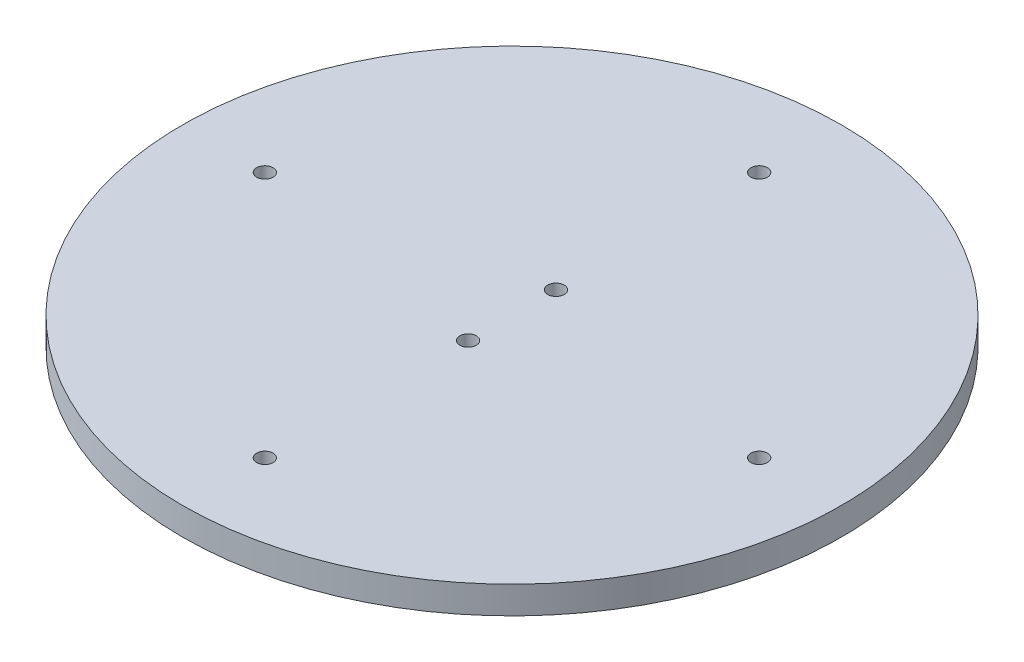
ISO-10303-21;
HEADER;
FILE_DESCRIPTION(('STEP AP214'),'2;1');
FILE_NAME('part.step','',(''),(''),'','','');
FILE_SCHEMA(('AUTOMOTIVE_DESIGN { 1 0 10303 214 1 1 1 1 }'));
ENDSEC;
DATA;
#1=APPLICATION_CONTEXT('core data for automotive mechanical design processes');
#2=APPLICATION_PROTOCOL_DEFINITION('international standard','automotive_design',2000,#1);
#3=PRODUCT_CONTEXT('',#1,'mechanical');
#4=PRODUCT('Part','Part','',(#3));
#5=PRODUCT_RELATED_PRODUCT_CATEGORY('part','',(#4));
#6=PRODUCT_DEFINITION_FORMATION('','',#4);
#7=PRODUCT_DEFINITION_CONTEXT('part definition',#1,'design');
#8=PRODUCT_DEFINITION('design','',#6,#7);
#9=PRODUCT_DEFINITION_SHAPE('','',#8);
#10=(LENGTH_UNIT() NAMED_UNIT(*) SI_UNIT(.MILLI.,.METRE.));
#11=(NAMED_UNIT(*) PLANE_ANGLE_UNIT() SI_UNIT($,.RADIAN.));
#12=(NAMED_UNIT(*) SI_UNIT($,.STERADIAN.) SOLID_ANGLE_UNIT());
#13=UNCERTAINTY_MEASURE_WITH_UNIT(LENGTH_MEASURE(1.E-05),#10,'distance_accuracy_value','');
#14=(GEOMETRIC_REPRESENTATION_CONTEXT(3) GLOBAL_UNCERTAINTY_ASSIGNED_CONTEXT((#13)) GLOBAL_UNIT_ASSIGNED_CONTEXT((#10,
#11,#12)) REPRESENTATION_CONTEXT('',''));
#15=CARTESIAN_POINT('',(0.,0.,0.));
#16=DIRECTION('',(0.,0.,1.));
#17=DIRECTION('',(1.,0.,0.));
#18=AXIS2_PLACEMENT_3D('',#15,#16,#17);
#19=CARTESIAN_POINT('',(0.,5.,0.));
#20=DIRECTION('',(0.,-1.,0.));
#21=DIRECTION('',(0.,0.,-1.));
#22=AXIS2_PLACEMENT_3D('',#19,#20,#21);
#23=CYLINDRICAL_SURFACE('',#22,60.);
#24=CARTESIAN_POINT('',(0.,5.,0.));
#25=DIRECTION('',(0.,1.,0.));
#26=DIRECTION('',(0.,0.,1.));
#27=AXIS2_PLACEMENT_3D('',#24,#25,#26);
#28=CIRCLE('',#27,60.);
#29=CARTESIAN_POINT('',(0.,5.,60.));
#30=VERTEX_POINT('',#29);
#31=EDGE_CURVE('E10',#30,#30,#28,.T.);
#32=ORIENTED_EDGE('',*,*,#31,.F.);
#33=EDGE_LOOP('',(#32));
#34=FACE_BOUND('',#33,.T.);
#35=CARTESIAN_POINT('',(0.,0.,0.));
#36=DIRECTION('',(0.,1.,0.));
#37=DIRECTION('',(0.,0.,1.));
#38=AXIS2_PLACEMENT_3D('',#35,#36,#37);
#39=CIRCLE('',#38,60.);
#40=CARTESIAN_POINT('',(0.,0.,60.));
#41=VERTEX_POINT('',#40);
#42=EDGE_CURVE('E41',#41,#41,#39,.T.);
#43=ORIENTED_EDGE('',*,*,#42,.T.);
#44=EDGE_LOOP('',(#43));
#45=FACE_BOUND('',#44,.T.);
#46=ADVANCED_FACE('F38',(#34,#45),#23,.T.);
#47=CARTESIAN_POINT('',(0.,5.,0.));
#48=DIRECTION('',(0.,1.,0.));
#49=DIRECTION('',(0.,0.,1.));
#50=AXIS2_PLACEMENT_3D('',#47,#48,#49);
#51=PLANE('',#50);
#52=CARTESIAN_POINT('',(0.,5.,8.));
#53=DIRECTION('',(0.,1.,0.));
#54=DIRECTION('',(0.,0.,1.));
#55=AXIS2_PLACEMENT_3D('',#52,#53,#54);
#56=CIRCLE('',#55,1.5);
#57=CARTESIAN_POINT('',(0.,5.,9.5));
#58=VERTEX_POINT('',#57);
#59=EDGE_CURVE('E89',#58,#58,#56,.T.);
#60=ORIENTED_EDGE('',*,*,#59,.F.);
#61=EDGE_LOOP('',(#60));
#62=FACE_BOUND('',#61,.T.);
#63=CARTESIAN_POINT('',(0.,5.,-8.));
#64=DIRECTION('',(0.,1.,0.));
#65=DIRECTION('',(0.,0.,-1.));
#66=AXIS2_PLACEMENT_3D('',#63,#64,#65);
#67=CIRCLE('',#66,1.5);
#68=CARTESIAN_POINT('',(0.,5.,-9.5));
#69=VERTEX_POINT('',#68);
#70=EDGE_CURVE('E90',#69,#69,#67,.T.);
#71=ORIENTED_EDGE('',*,*,#70,.F.);
#72=EDGE_LOOP('',(#71));
#73=FACE_BOUND('',#72,.T.);
#74=CARTESIAN_POINT('',(45.,5.,0.));
#75=DIRECTION('',(0.,1.,0.));
#76=DIRECTION('',(0.,0.,1.));
#77=AXIS2_PLACEMENT_3D('',#74,#75,#76);
#78=CIRCLE('',#77,1.5);
#79=CARTESIAN_POINT('',(45.,5.,1.5));
#80=VERTEX_POINT('',#79);
#81=EDGE_CURVE('E78',#80,#80,#78,.T.);
#82=ORIENTED_EDGE('',*,*,#81,.F.);
#83=EDGE_LOOP('',(#82));
#84=FACE_BOUND('',#83,.T.);
#85=CARTESIAN_POINT('',(0.,5.,45.));
#86=DIRECTION('',(0.,1.,0.));
#87=DIRECTION('',(0.,0.,1.));
#88=AXIS2_PLACEMENT_3D('',#85,#86,#87);
#89=CIRCLE('',#88,1.5);
#90=CARTESIAN_POINT('',(0.,5.,46.5));
#91=VERTEX_POINT('',#90);
#92=EDGE_CURVE('E70',#91,#91,#89,.T.);
#93=ORIENTED_EDGE('',*,*,#92,.F.);
#94=EDGE_LOOP('',(#93));
#95=FACE_BOUND('',#94,.T.);
#96=CARTESIAN_POINT('',(-45.,5.,0.));
#97=DIRECTION('',(0.,1.,0.));
#98=DIRECTION('',(0.,0.,1.));
#99=AXIS2_PLACEMENT_3D('',#96,#97,#98);
#100=CIRCLE('',#99,1.5);
#101=CARTESIAN_POINT('',(-45.,5.,1.5));
#102=VERTEX_POINT('',#101);
#103=EDGE_CURVE('E62',#102,#102,#100,.T.);
#104=ORIENTED_EDGE('',*,*,#103,.F.);
#105=EDGE_LOOP('',(#104));
#106=FACE_BOUND('',#105,.T.);
#107=CARTESIAN_POINT('',(0.,5.,-45.));
#108=DIRECTION('',(0.,1.,0.));
#109=DIRECTION('',(0.,0.,1.));
#110=AXIS2_PLACEMENT_3D('',#107,#108,#109);
#111=CIRCLE('',#110,1.5);
#112=CARTESIAN_POINT('',(0.,5.,-43.5));
#113=VERTEX_POINT('',#112);
#114=EDGE_CURVE('E53',#113,#113,#111,.T.);
#115=ORIENTED_EDGE('',*,*,#114,.F.);
#116=EDGE_LOOP('',(#115));
#117=FACE_BOUND('',#116,.T.);
#118=ORIENTED_EDGE('',*,*,#31,.T.);
#119=EDGE_LOOP('',(#118));
#120=FACE_BOUND('',#119,.T.);
#121=ADVANCED_FACE('F105',(#62,#73,#84,#95,#106,#117,#120),#51,.T.);
#122=CARTESIAN_POINT('',(0.,0.,0.));
#123=DIRECTION('',(0.,1.,0.));
#124=DIRECTION('',(0.,0.,1.));
#125=AXIS2_PLACEMENT_3D('',#122,#123,#124);
#126=PLANE('',#125);
#127=CARTESIAN_POINT('',(0.,0.,8.));
#128=DIRECTION('',(0.,1.,0.));
#129=DIRECTION('',(0.,0.,1.));
#130=AXIS2_PLACEMENT_3D('',#127,#128,#129);
#131=CIRCLE('',#130,1.5);
#132=CARTESIAN_POINT('',(0.,0.,9.5));
#133=VERTEX_POINT('',#132);
#134=EDGE_CURVE('E58',#133,#133,#131,.F.);
#135=ORIENTED_EDGE('',*,*,#134,.F.);
#136=EDGE_LOOP('',(#135));
#137=FACE_BOUND('',#136,.T.);
#138=CARTESIAN_POINT('',(0.,0.,-8.));
#139=DIRECTION('',(0.,1.,0.));
#140=DIRECTION('',(0.,0.,1.));
#141=AXIS2_PLACEMENT_3D('',#138,#139,#140);
#142=CIRCLE('',#141,1.5);
#143=CARTESIAN_POINT('',(0.,0.,-6.5));
#144=VERTEX_POINT('',#143);
#145=EDGE_CURVE('E85',#144,#144,#142,.F.);
#146=ORIENTED_EDGE('',*,*,#145,.F.);
#147=EDGE_LOOP('',(#146));
#148=FACE_BOUND('',#147,.T.);
#149=CARTESIAN_POINT('',(45.,0.,0.));
#150=DIRECTION('',(0.,1.,0.));
#151=DIRECTION('',(0.,0.,1.));
#152=AXIS2_PLACEMENT_3D('',#149,#150,#151);
#153=CIRCLE('',#152,1.5);
#154=CARTESIAN_POINT('',(45.,0.,1.5));
#155=VERTEX_POINT('',#154);
#156=EDGE_CURVE('E51',#155,#155,#153,.T.);
#157=ORIENTED_EDGE('',*,*,#156,.T.);
#158=EDGE_LOOP('',(#157));
#159=FACE_BOUND('',#158,.T.);
#160=CARTESIAN_POINT('',(0.,0.,45.));
#161=DIRECTION('',(0.,1.,0.));
#162=DIRECTION('',(0.,0.,1.));
#163=AXIS2_PLACEMENT_3D('',#160,#161,#162);
#164=CIRCLE('',#163,1.5);
#165=CARTESIAN_POINT('',(0.,0.,46.5));
#166=VERTEX_POINT('',#165);
#167=EDGE_CURVE('E74',#166,#166,#164,.T.);
#168=ORIENTED_EDGE('',*,*,#167,.T.);
#169=EDGE_LOOP('',(#168));
#170=FACE_BOUND('',#169,.T.);
#171=CARTESIAN_POINT('',(-45.,0.,0.));
#172=DIRECTION('',(0.,1.,0.));
#173=DIRECTION('',(0.,0.,1.));
#174=AXIS2_PLACEMENT_3D('',#171,#172,#173);
#175=CIRCLE('',#174,1.5);
#176=CARTESIAN_POINT('',(-45.,0.,1.5));
#177=VERTEX_POINT('',#176);
#178=EDGE_CURVE('E66',#177,#177,#175,.T.);
#179=ORIENTED_EDGE('',*,*,#178,.T.);
#180=EDGE_LOOP('',(#179));
#181=FACE_BOUND('',#180,.T.);
#182=CARTESIAN_POINT('',(0.,0.,-45.));
#183=DIRECTION('',(0.,1.,0.));
#184=DIRECTION('',(0.,0.,1.));
#185=AXIS2_PLACEMENT_3D('',#182,#183,#184);
#186=CIRCLE('',#185,1.5);
#187=CARTESIAN_POINT('',(0.,0.,-43.5));
#188=VERTEX_POINT('',#187);
#189=EDGE_CURVE('E57',#188,#188,#186,.T.);
#190=ORIENTED_EDGE('',*,*,#189,.T.);
#191=EDGE_LOOP('',(#190));
#192=FACE_BOUND('',#191,.T.);
#193=ORIENTED_EDGE('',*,*,#42,.F.);
#194=EDGE_LOOP('',(#193));
#195=FACE_BOUND('',#194,.T.);
#196=ADVANCED_FACE('F108',(#137,#148,#159,#170,#181,#192,#195),#126,.F.);
#197=CARTESIAN_POINT('',(0.,0.,-45.));
#198=DIRECTION('',(0.,1.,0.));
#199=DIRECTION('',(0.,0.,1.));
#200=AXIS2_PLACEMENT_3D('',#197,#198,#199);
#201=CYLINDRICAL_SURFACE('',#200,1.5);
#202=ORIENTED_EDGE('',*,*,#189,.F.);
#203=EDGE_LOOP('',(#202));
#204=FACE_BOUND('',#203,.T.);
#205=ORIENTED_EDGE('',*,*,#114,.T.);
#206=EDGE_LOOP('',(#205));
#207=FACE_BOUND('',#206,.T.);
#208=ADVANCED_FACE('F120',(#204,#207),#201,.F.);
#209=CARTESIAN_POINT('',(-45.,0.,0.));
#210=DIRECTION('',(0.,1.,0.));
#211=DIRECTION('',(0.,0.,1.));
#212=AXIS2_PLACEMENT_3D('',#209,#210,#211);
#213=CYLINDRICAL_SURFACE('',#212,1.5);
#214=ORIENTED_EDGE('',*,*,#178,.F.);
#215=EDGE_LOOP('',(#214));
#216=FACE_BOUND('',#215,.T.);
#217=ORIENTED_EDGE('',*,*,#103,.T.);
#218=EDGE_LOOP('',(#217));
#219=FACE_BOUND('',#218,.T.);
#220=ADVANCED_FACE('F122',(#216,#219),#213,.F.);
#221=CARTESIAN_POINT('',(0.,0.,45.));
#222=DIRECTION('',(0.,1.,0.));
#223=DIRECTION('',(0.,0.,1.));
#224=AXIS2_PLACEMENT_3D('',#221,#222,#223);
#225=CYLINDRICAL_SURFACE('',#224,1.5);
#226=ORIENTED_EDGE('',*,*,#167,.F.);
#227=EDGE_LOOP('',(#226));
#228=FACE_BOUND('',#227,.T.);
#229=ORIENTED_EDGE('',*,*,#92,.T.);
#230=EDGE_LOOP('',(#229));
#231=FACE_BOUND('',#230,.T.);
#232=ADVANCED_FACE('F129',(#228,#231),#225,.F.);
#233=CARTESIAN_POINT('',(45.,0.,0.));
#234=DIRECTION('',(0.,1.,0.));
#235=DIRECTION('',(0.,0.,1.));
#236=AXIS2_PLACEMENT_3D('',#233,#234,#235);
#237=CYLINDRICAL_SURFACE('',#236,1.5);
#238=ORIENTED_EDGE('',*,*,#156,.F.);
#239=EDGE_LOOP('',(#238));
#240=FACE_BOUND('',#239,.T.);
#241=ORIENTED_EDGE('',*,*,#81,.T.);
#242=EDGE_LOOP('',(#241));
#243=FACE_BOUND('',#242,.T.);
#244=ADVANCED_FACE('F168',(#240,#243),#237,.F.);
#245=CARTESIAN_POINT('',(0.,-0.00100000000000013,-8.));
#246=DIRECTION('',(0.,1.,0.));
#247=DIRECTION('',(0.,0.,1.));
#248=AXIS2_PLACEMENT_3D('',#245,#246,#247);
#249=CYLINDRICAL_SURFACE('',#248,1.5);
#250=ORIENTED_EDGE('',*,*,#70,.T.);
#251=EDGE_LOOP('',(#250));
#252=FACE_BOUND('',#251,.T.);
#253=ORIENTED_EDGE('',*,*,#145,.T.);
#254=EDGE_LOOP('',(#253));
#255=FACE_BOUND('',#254,.T.);
#256=ADVANCED_FACE('F178',(#252,#255),#249,.F.);
#257=CARTESIAN_POINT('',(0.,-0.00100000000000013,8.));
#258=DIRECTION('',(0.,1.,0.));
#259=DIRECTION('',(0.,0.,1.));
#260=AXIS2_PLACEMENT_3D('',#257,#258,#259);
#261=CYLINDRICAL_SURFACE('',#260,1.5);
#262=ORIENTED_EDGE('',*,*,#59,.T.);
#263=EDGE_LOOP('',(#262));
#264=FACE_BOUND('',#263,.T.);
#265=ORIENTED_EDGE('',*,*,#134,.T.);
#266=EDGE_LOOP('',(#265));
#267=FACE_BOUND('',#266,.T.);
#268=ADVANCED_FACE('F102',(#264,#267),#261,.F.);
#269=CLOSED_SHELL('',(#46,#121,#196,#208,#220,#232,#244,#256,#268));
#270=MANIFOLD_SOLID_BREP('B2',#269);
#271=ADVANCED_BREP_SHAPE_REPRESENTATION('',(#18,#270),#14);
#272=SHAPE_DEFINITION_REPRESENTATION(#9,#271);
ENDSEC;
END-ISO-10303-21;
